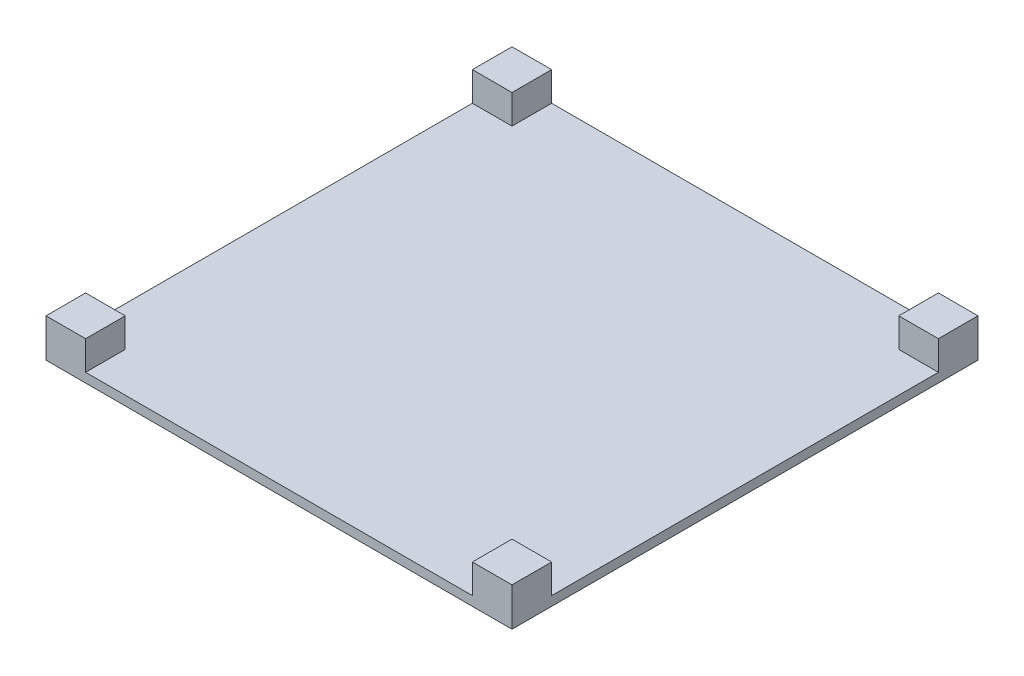
ISO-10303-21;
HEADER;
FILE_DESCRIPTION(('STEP AP214'),'2;1');
FILE_NAME('part.step','',(''),(''),'','','');
FILE_SCHEMA(('AUTOMOTIVE_DESIGN { 1 0 10303 214 1 1 1 1 }'));
ENDSEC;
DATA;
#1=APPLICATION_CONTEXT('core data for automotive mechanical design processes');
#2=APPLICATION_PROTOCOL_DEFINITION('international standard','automotive_design',2000,#1);
#3=PRODUCT_CONTEXT('',#1,'mechanical');
#4=PRODUCT('Part','Part','',(#3));
#5=PRODUCT_RELATED_PRODUCT_CATEGORY('part','',(#4));
#6=PRODUCT_DEFINITION_FORMATION('','',#4);
#7=PRODUCT_DEFINITION_CONTEXT('part definition',#1,'design');
#8=PRODUCT_DEFINITION('design','',#6,#7);
#9=PRODUCT_DEFINITION_SHAPE('','',#8);
#10=(LENGTH_UNIT() NAMED_UNIT(*) SI_UNIT(.MILLI.,.METRE.));
#11=(NAMED_UNIT(*) PLANE_ANGLE_UNIT() SI_UNIT($,.RADIAN.));
#12=(NAMED_UNIT(*) SI_UNIT($,.STERADIAN.) SOLID_ANGLE_UNIT());
#13=UNCERTAINTY_MEASURE_WITH_UNIT(LENGTH_MEASURE(1.E-05),#10,'distance_accuracy_value','');
#14=(GEOMETRIC_REPRESENTATION_CONTEXT(3) GLOBAL_UNCERTAINTY_ASSIGNED_CONTEXT((#13)) GLOBAL_UNIT_ASSIGNED_CONTEXT((#10,
#11,#12)) REPRESENTATION_CONTEXT('',''));
#15=CARTESIAN_POINT('',(0.,0.,0.));
#16=DIRECTION('',(0.,0.,1.));
#17=DIRECTION('',(1.,0.,0.));
#18=AXIS2_PLACEMENT_3D('',#15,#16,#17);
#19=CARTESIAN_POINT('',(0.,2.,0.));
#20=DIRECTION('',(0.,-1.,0.));
#21=DIRECTION('',(0.,0.,-1.));
#22=AXIS2_PLACEMENT_3D('',#19,#20,#21);
#23=PLANE('',#22);
#24=DIRECTION('',(1.,0.,0.));
#25=VECTOR('',#24,1.);
#26=CARTESIAN_POINT('',(-50.,2.,-41.5));
#27=LINE('',#26,#25);
#28=CARTESIAN_POINT('',(-50.,2.,-41.5));
#29=VERTEX_POINT('',#28);
#30=CARTESIAN_POINT('',(-41.5,2.,-41.5));
#31=VERTEX_POINT('',#30);
#32=EDGE_CURVE('E330',#29,#31,#27,.T.);
#33=ORIENTED_EDGE('',*,*,#32,.F.);
#34=DIRECTION('',(0.,0.,1.));
#35=VECTOR('',#34,1.);
#36=CARTESIAN_POINT('',(-50.,2.,50.));
#37=LINE('',#36,#35);
#38=CARTESIAN_POINT('',(-50.,2.,41.5));
#39=VERTEX_POINT('',#38);
#40=EDGE_CURVE('E167',#29,#39,#37,.T.);
#41=ORIENTED_EDGE('',*,*,#40,.T.);
#42=DIRECTION('',(-1.,0.,0.));
#43=VECTOR('',#42,1.);
#44=CARTESIAN_POINT('',(-50.,2.,41.5));
#45=LINE('',#44,#43);
#46=CARTESIAN_POINT('',(-41.5,2.,41.5));
#47=VERTEX_POINT('',#46);
#48=EDGE_CURVE('E202',#47,#39,#45,.T.);
#49=ORIENTED_EDGE('',*,*,#48,.F.);
#50=DIRECTION('',(0.,0.,-1.));
#51=VECTOR('',#50,1.);
#52=CARTESIAN_POINT('',(-41.5,2.,50.));
#53=LINE('',#52,#51);
#54=CARTESIAN_POINT('',(-41.5,2.,50.));
#55=VERTEX_POINT('',#54);
#56=EDGE_CURVE('E197',#55,#47,#53,.T.);
#57=ORIENTED_EDGE('',*,*,#56,.F.);
#58=DIRECTION('',(1.,0.,0.));
#59=VECTOR('',#58,1.);
#60=CARTESIAN_POINT('',(-50.,2.,50.));
#61=LINE('',#60,#59);
#62=CARTESIAN_POINT('',(41.5,2.,50.));
#63=VERTEX_POINT('',#62);
#64=EDGE_CURVE('E251',#55,#63,#61,.T.);
#65=ORIENTED_EDGE('',*,*,#64,.T.);
#66=DIRECTION('',(0.,0.,1.));
#67=VECTOR('',#66,1.);
#68=CARTESIAN_POINT('',(41.5,2.,50.));
#69=LINE('',#68,#67);
#70=CARTESIAN_POINT('',(41.5,2.,41.5));
#71=VERTEX_POINT('',#70);
#72=EDGE_CURVE('E225',#71,#63,#69,.T.);
#73=ORIENTED_EDGE('',*,*,#72,.F.);
#74=DIRECTION('',(-1.,0.,0.));
#75=VECTOR('',#74,1.);
#76=CARTESIAN_POINT('',(50.,2.,41.5));
#77=LINE('',#76,#75);
#78=CARTESIAN_POINT('',(50.,2.,41.5));
#79=VERTEX_POINT('',#78);
#80=EDGE_CURVE('E220',#79,#71,#77,.T.);
#81=ORIENTED_EDGE('',*,*,#80,.F.);
#82=DIRECTION('',(0.,0.,-1.));
#83=VECTOR('',#82,1.);
#84=CARTESIAN_POINT('',(50.,2.,50.));
#85=LINE('',#84,#83);
#86=CARTESIAN_POINT('',(50.,2.,-41.5));
#87=VERTEX_POINT('',#86);
#88=EDGE_CURVE('E246',#79,#87,#85,.T.);
#89=ORIENTED_EDGE('',*,*,#88,.T.);
#90=DIRECTION('',(1.,0.,0.));
#91=VECTOR('',#90,1.);
#92=CARTESIAN_POINT('',(50.,2.,-41.5));
#93=LINE('',#92,#91);
#94=CARTESIAN_POINT('',(41.5,2.,-41.5));
#95=VERTEX_POINT('',#94);
#96=EDGE_CURVE('E171',#95,#87,#93,.T.);
#97=ORIENTED_EDGE('',*,*,#96,.F.);
#98=DIRECTION('',(0.,0.,1.));
#99=VECTOR('',#98,1.);
#100=CARTESIAN_POINT('',(41.5,2.,-50.));
#101=LINE('',#100,#99);
#102=CARTESIAN_POINT('',(41.5,2.,-50.));
#103=VERTEX_POINT('',#102);
#104=EDGE_CURVE('E168',#103,#95,#101,.T.);
#105=ORIENTED_EDGE('',*,*,#104,.F.);
#106=DIRECTION('',(-1.,0.,0.));
#107=VECTOR('',#106,1.);
#108=CARTESIAN_POINT('',(-50.,2.,-50.));
#109=LINE('',#108,#107);
#110=CARTESIAN_POINT('',(-41.5,2.,-50.));
#111=VERTEX_POINT('',#110);
#112=EDGE_CURVE('E53',#103,#111,#109,.T.);
#113=ORIENTED_EDGE('',*,*,#112,.T.);
#114=DIRECTION('',(0.,0.,-1.));
#115=VECTOR('',#114,1.);
#116=CARTESIAN_POINT('',(-41.5,2.,-50.));
#117=LINE('',#116,#115);
#118=EDGE_CURVE('E48',#31,#111,#117,.T.);
#119=ORIENTED_EDGE('',*,*,#118,.F.);
#120=EDGE_LOOP('',(#33,#41,#49,#57,#65,#73,#81,#89,#97,#105,#113,#119));
#121=FACE_BOUND('',#120,.T.);
#122=ADVANCED_FACE('F33',(#121),#23,.F.);
#123=CARTESIAN_POINT('',(50.,2.,50.));
#124=DIRECTION('',(-1.,0.,0.));
#125=DIRECTION('',(0.,0.,1.));
#126=AXIS2_PLACEMENT_3D('',#123,#124,#125);
#127=PLANE('',#126);
#128=DIRECTION('',(0.,0.,-1.));
#129=VECTOR('',#128,1.);
#130=CARTESIAN_POINT('',(50.,0.,50.));
#131=LINE('',#130,#129);
#132=CARTESIAN_POINT('',(50.,0.,50.));
#133=VERTEX_POINT('',#132);
#134=CARTESIAN_POINT('',(50.,0.,-50.));
#135=VERTEX_POINT('',#134);
#136=EDGE_CURVE('E245',#133,#135,#131,.T.);
#137=ORIENTED_EDGE('',*,*,#136,.T.);
#138=DIRECTION('',(0.,-1.,0.));
#139=VECTOR('',#138,1.);
#140=CARTESIAN_POINT('',(50.,2.,-50.));
#141=LINE('',#140,#139);
#142=CARTESIAN_POINT('',(50.,8.25,-50.));
#143=VERTEX_POINT('',#142);
#144=EDGE_CURVE('E11',#143,#135,#141,.T.);
#145=ORIENTED_EDGE('',*,*,#144,.F.);
#146=DIRECTION('',(0.,0.,-1.));
#147=VECTOR('',#146,1.);
#148=CARTESIAN_POINT('',(50.,8.25,-50.));
#149=LINE('',#148,#147);
#150=CARTESIAN_POINT('',(50.,8.25,-41.5));
#151=VERTEX_POINT('',#150);
#152=EDGE_CURVE('E177',#151,#143,#149,.T.);
#153=ORIENTED_EDGE('',*,*,#152,.F.);
#154=DIRECTION('',(0.,-1.,0.));
#155=VECTOR('',#154,1.);
#156=CARTESIAN_POINT('',(50.,8.25,-41.5));
#157=LINE('',#156,#155);
#158=EDGE_CURVE('E185',#151,#87,#157,.T.);
#159=ORIENTED_EDGE('',*,*,#158,.T.);
#160=ORIENTED_EDGE('',*,*,#88,.F.);
#161=DIRECTION('',(0.,-1.,0.));
#162=VECTOR('',#161,1.);
#163=CARTESIAN_POINT('',(50.,8.25,41.5));
#164=LINE('',#163,#162);
#165=CARTESIAN_POINT('',(50.,8.25,41.5));
#166=VERTEX_POINT('',#165);
#167=EDGE_CURVE('E242',#166,#79,#164,.T.);
#168=ORIENTED_EDGE('',*,*,#167,.F.);
#169=DIRECTION('',(0.,0.,-1.));
#170=VECTOR('',#169,1.);
#171=CARTESIAN_POINT('',(50.,8.25,50.));
#172=LINE('',#171,#170);
#173=CARTESIAN_POINT('',(50.,8.25,50.));
#174=VERTEX_POINT('',#173);
#175=EDGE_CURVE('E221',#174,#166,#172,.T.);
#176=ORIENTED_EDGE('',*,*,#175,.F.);
#177=DIRECTION('',(0.,-1.,0.));
#178=VECTOR('',#177,1.);
#179=CARTESIAN_POINT('',(50.,2.,50.));
#180=LINE('',#179,#178);
#181=EDGE_CURVE('E253',#174,#133,#180,.T.);
#182=ORIENTED_EDGE('',*,*,#181,.T.);
#183=EDGE_LOOP('',(#137,#145,#153,#159,#160,#168,#176,#182));
#184=FACE_BOUND('',#183,.T.);
#185=ADVANCED_FACE('F35',(#184),#127,.F.);
#186=CARTESIAN_POINT('',(-50.,2.,-50.));
#187=DIRECTION('',(0.,0.,1.));
#188=DIRECTION('',(1.,0.,0.));
#189=AXIS2_PLACEMENT_3D('',#186,#187,#188);
#190=PLANE('',#189);
#191=DIRECTION('',(-1.,0.,0.));
#192=VECTOR('',#191,1.);
#193=CARTESIAN_POINT('',(-50.,0.,-50.));
#194=LINE('',#193,#192);
#195=CARTESIAN_POINT('',(-50.,0.,-50.));
#196=VERTEX_POINT('',#195);
#197=EDGE_CURVE('E256',#135,#196,#194,.T.);
#198=ORIENTED_EDGE('',*,*,#197,.T.);
#199=DIRECTION('',(0.,-1.,0.));
#200=VECTOR('',#199,1.);
#201=CARTESIAN_POINT('',(-50.,2.,-50.));
#202=LINE('',#201,#200);
#203=CARTESIAN_POINT('',(-50.,8.25,-50.));
#204=VERTEX_POINT('',#203);
#205=EDGE_CURVE('E41',#204,#196,#202,.T.);
#206=ORIENTED_EDGE('',*,*,#205,.F.);
#207=DIRECTION('',(-1.,0.,0.));
#208=VECTOR('',#207,1.);
#209=CARTESIAN_POINT('',(-50.,8.25,-50.));
#210=LINE('',#209,#208);
#211=CARTESIAN_POINT('',(-41.5,8.25,-50.));
#212=VERTEX_POINT('',#211);
#213=EDGE_CURVE('E161',#212,#204,#210,.T.);
#214=ORIENTED_EDGE('',*,*,#213,.F.);
#215=DIRECTION('',(0.,-1.,0.));
#216=VECTOR('',#215,1.);
#217=CARTESIAN_POINT('',(-41.5,8.25,-50.));
#218=LINE('',#217,#216);
#219=EDGE_CURVE('E173',#212,#111,#218,.T.);
#220=ORIENTED_EDGE('',*,*,#219,.T.);
#221=ORIENTED_EDGE('',*,*,#112,.F.);
#222=DIRECTION('',(0.,-1.,0.));
#223=VECTOR('',#222,1.);
#224=CARTESIAN_POINT('',(41.5,8.25,-50.));
#225=LINE('',#224,#223);
#226=CARTESIAN_POINT('',(41.5,8.25,-50.));
#227=VERTEX_POINT('',#226);
#228=EDGE_CURVE('E194',#227,#103,#225,.T.);
#229=ORIENTED_EDGE('',*,*,#228,.F.);
#230=DIRECTION('',(-1.,0.,0.));
#231=VECTOR('',#230,1.);
#232=CARTESIAN_POINT('',(50.,8.25,-50.));
#233=LINE('',#232,#231);
#234=EDGE_CURVE('E180',#143,#227,#233,.T.);
#235=ORIENTED_EDGE('',*,*,#234,.F.);
#236=ORIENTED_EDGE('',*,*,#144,.T.);
#237=EDGE_LOOP('',(#198,#206,#214,#220,#221,#229,#235,#236));
#238=FACE_BOUND('',#237,.T.);
#239=ADVANCED_FACE('F303',(#238),#190,.F.);
#240=CARTESIAN_POINT('',(-50.,2.,50.));
#241=DIRECTION('',(1.,0.,0.));
#242=DIRECTION('',(0.,0.,-1.));
#243=AXIS2_PLACEMENT_3D('',#240,#241,#242);
#244=PLANE('',#243);
#245=DIRECTION('',(0.,0.,1.));
#246=VECTOR('',#245,1.);
#247=CARTESIAN_POINT('',(-50.,0.,50.));
#248=LINE('',#247,#246);
#249=CARTESIAN_POINT('',(-50.,0.,50.));
#250=VERTEX_POINT('',#249);
#251=EDGE_CURVE('E258',#196,#250,#248,.T.);
#252=ORIENTED_EDGE('',*,*,#251,.T.);
#253=DIRECTION('',(0.,-1.,0.));
#254=VECTOR('',#253,1.);
#255=CARTESIAN_POINT('',(-50.,2.,50.));
#256=LINE('',#255,#254);
#257=CARTESIAN_POINT('',(-50.,8.25,50.));
#258=VERTEX_POINT('',#257);
#259=EDGE_CURVE('E263',#258,#250,#256,.T.);
#260=ORIENTED_EDGE('',*,*,#259,.F.);
#261=DIRECTION('',(0.,0.,1.));
#262=VECTOR('',#261,1.);
#263=CARTESIAN_POINT('',(-50.,8.25,50.));
#264=LINE('',#263,#262);
#265=CARTESIAN_POINT('',(-50.,8.25,41.5));
#266=VERTEX_POINT('',#265);
#267=EDGE_CURVE('E198',#266,#258,#264,.T.);
#268=ORIENTED_EDGE('',*,*,#267,.F.);
#269=DIRECTION('',(0.,-1.,0.));
#270=VECTOR('',#269,1.);
#271=CARTESIAN_POINT('',(-50.,8.25,41.5));
#272=LINE('',#271,#270);
#273=EDGE_CURVE('E208',#266,#39,#272,.T.);
#274=ORIENTED_EDGE('',*,*,#273,.T.);
#275=ORIENTED_EDGE('',*,*,#40,.F.);
#276=DIRECTION('',(0.,-1.,0.));
#277=VECTOR('',#276,1.);
#278=CARTESIAN_POINT('',(-50.,8.25,-41.5));
#279=LINE('',#278,#277);
#280=CARTESIAN_POINT('',(-50.,8.25,-41.5));
#281=VERTEX_POINT('',#280);
#282=EDGE_CURVE('E149',#281,#29,#279,.T.);
#283=ORIENTED_EDGE('',*,*,#282,.F.);
#284=DIRECTION('',(0.,0.,1.));
#285=VECTOR('',#284,1.);
#286=CARTESIAN_POINT('',(-50.,8.25,-50.));
#287=LINE('',#286,#285);
#288=EDGE_CURVE('E155',#204,#281,#287,.T.);
#289=ORIENTED_EDGE('',*,*,#288,.F.);
#290=ORIENTED_EDGE('',*,*,#205,.T.);
#291=EDGE_LOOP('',(#252,#260,#268,#274,#275,#283,#289,#290));
#292=FACE_BOUND('',#291,.T.);
#293=ADVANCED_FACE('F165',(#292),#244,.F.);
#294=CARTESIAN_POINT('',(-50.,2.,50.));
#295=DIRECTION('',(0.,0.,-1.));
#296=DIRECTION('',(-1.,0.,0.));
#297=AXIS2_PLACEMENT_3D('',#294,#295,#296);
#298=PLANE('',#297);
#299=DIRECTION('',(1.,0.,0.));
#300=VECTOR('',#299,1.);
#301=CARTESIAN_POINT('',(-50.,0.,50.));
#302=LINE('',#301,#300);
#303=EDGE_CURVE('E248',#250,#133,#302,.T.);
#304=ORIENTED_EDGE('',*,*,#303,.T.);
#305=ORIENTED_EDGE('',*,*,#181,.F.);
#306=DIRECTION('',(1.,0.,0.));
#307=VECTOR('',#306,1.);
#308=CARTESIAN_POINT('',(50.,8.25,50.));
#309=LINE('',#308,#307);
#310=CARTESIAN_POINT('',(41.5,8.25,50.));
#311=VERTEX_POINT('',#310);
#312=EDGE_CURVE('E229',#311,#174,#309,.T.);
#313=ORIENTED_EDGE('',*,*,#312,.F.);
#314=DIRECTION('',(0.,-1.,0.));
#315=VECTOR('',#314,1.);
#316=CARTESIAN_POINT('',(41.5,8.25,50.));
#317=LINE('',#316,#315);
#318=EDGE_CURVE('E232',#311,#63,#317,.T.);
#319=ORIENTED_EDGE('',*,*,#318,.T.);
#320=ORIENTED_EDGE('',*,*,#64,.F.);
#321=DIRECTION('',(0.,-1.,0.));
#322=VECTOR('',#321,1.);
#323=CARTESIAN_POINT('',(-41.5,8.25,50.));
#324=LINE('',#323,#322);
#325=CARTESIAN_POINT('',(-41.5,8.25,50.));
#326=VERTEX_POINT('',#325);
#327=EDGE_CURVE('E217',#326,#55,#324,.T.);
#328=ORIENTED_EDGE('',*,*,#327,.F.);
#329=DIRECTION('',(1.,0.,0.));
#330=VECTOR('',#329,1.);
#331=CARTESIAN_POINT('',(-50.,8.25,50.));
#332=LINE('',#331,#330);
#333=EDGE_CURVE('E201',#258,#326,#332,.T.);
#334=ORIENTED_EDGE('',*,*,#333,.F.);
#335=ORIENTED_EDGE('',*,*,#259,.T.);
#336=EDGE_LOOP('',(#304,#305,#313,#319,#320,#328,#334,#335));
#337=FACE_BOUND('',#336,.T.);
#338=ADVANCED_FACE('F272',(#337),#298,.F.);
#339=CARTESIAN_POINT('',(0.,0.,0.));
#340=DIRECTION('',(0.,-1.,0.));
#341=DIRECTION('',(0.,0.,-1.));
#342=AXIS2_PLACEMENT_3D('',#339,#340,#341);
#343=PLANE('',#342);
#344=ORIENTED_EDGE('',*,*,#136,.F.);
#345=ORIENTED_EDGE('',*,*,#303,.F.);
#346=ORIENTED_EDGE('',*,*,#251,.F.);
#347=ORIENTED_EDGE('',*,*,#197,.F.);
#348=EDGE_LOOP('',(#344,#345,#346,#347));
#349=FACE_BOUND('',#348,.T.);
#350=ADVANCED_FACE('F270',(#349),#343,.T.);
#351=CARTESIAN_POINT('',(50.,8.25,41.5));
#352=DIRECTION('',(0.,0.,1.));
#353=DIRECTION('',(1.,0.,0.));
#354=AXIS2_PLACEMENT_3D('',#351,#352,#353);
#355=PLANE('',#354);
#356=ORIENTED_EDGE('',*,*,#80,.T.);
#357=DIRECTION('',(0.,-1.,0.));
#358=VECTOR('',#357,1.);
#359=CARTESIAN_POINT('',(41.5,8.25,41.5));
#360=LINE('',#359,#358);
#361=CARTESIAN_POINT('',(41.5,8.25,41.5));
#362=VERTEX_POINT('',#361);
#363=EDGE_CURVE('E239',#362,#71,#360,.T.);
#364=ORIENTED_EDGE('',*,*,#363,.F.);
#365=DIRECTION('',(-1.,0.,0.));
#366=VECTOR('',#365,1.);
#367=CARTESIAN_POINT('',(50.,8.25,41.5));
#368=LINE('',#367,#366);
#369=EDGE_CURVE('E224',#166,#362,#368,.T.);
#370=ORIENTED_EDGE('',*,*,#369,.F.);
#371=ORIENTED_EDGE('',*,*,#167,.T.);
#372=EDGE_LOOP('',(#356,#364,#370,#371));
#373=FACE_BOUND('',#372,.T.);
#374=ADVANCED_FACE('F289',(#373),#355,.F.);
#375=CARTESIAN_POINT('',(41.5,8.25,50.));
#376=DIRECTION('',(1.,0.,0.));
#377=DIRECTION('',(0.,0.,-1.));
#378=AXIS2_PLACEMENT_3D('',#375,#376,#377);
#379=PLANE('',#378);
#380=ORIENTED_EDGE('',*,*,#72,.T.);
#381=ORIENTED_EDGE('',*,*,#318,.F.);
#382=DIRECTION('',(0.,0.,1.));
#383=VECTOR('',#382,1.);
#384=CARTESIAN_POINT('',(41.5,8.25,50.));
#385=LINE('',#384,#383);
#386=EDGE_CURVE('E227',#362,#311,#385,.T.);
#387=ORIENTED_EDGE('',*,*,#386,.F.);
#388=ORIENTED_EDGE('',*,*,#363,.T.);
#389=EDGE_LOOP('',(#380,#381,#387,#388));
#390=FACE_BOUND('',#389,.T.);
#391=ADVANCED_FACE('F287',(#390),#379,.F.);
#392=CARTESIAN_POINT('',(0.,8.25,0.));
#393=DIRECTION('',(0.,1.,0.));
#394=DIRECTION('',(0.,0.,1.));
#395=AXIS2_PLACEMENT_3D('',#392,#393,#394);
#396=PLANE('',#395);
#397=ORIENTED_EDGE('',*,*,#175,.T.);
#398=ORIENTED_EDGE('',*,*,#369,.T.);
#399=ORIENTED_EDGE('',*,*,#386,.T.);
#400=ORIENTED_EDGE('',*,*,#312,.T.);
#401=EDGE_LOOP('',(#397,#398,#399,#400));
#402=FACE_BOUND('',#401,.T.);
#403=ADVANCED_FACE('F280',(#402),#396,.T.);
#404=CARTESIAN_POINT('',(-41.5,8.25,50.));
#405=DIRECTION('',(-1.,0.,0.));
#406=DIRECTION('',(0.,0.,1.));
#407=AXIS2_PLACEMENT_3D('',#404,#405,#406);
#408=PLANE('',#407);
#409=ORIENTED_EDGE('',*,*,#56,.T.);
#410=DIRECTION('',(0.,-1.,0.));
#411=VECTOR('',#410,1.);
#412=CARTESIAN_POINT('',(-41.5,8.25,41.5));
#413=LINE('',#412,#411);
#414=CARTESIAN_POINT('',(-41.5,8.25,41.5));
#415=VERTEX_POINT('',#414);
#416=EDGE_CURVE('E214',#415,#47,#413,.T.);
#417=ORIENTED_EDGE('',*,*,#416,.F.);
#418=DIRECTION('',(0.,0.,-1.));
#419=VECTOR('',#418,1.);
#420=CARTESIAN_POINT('',(-41.5,8.25,50.));
#421=LINE('',#420,#419);
#422=EDGE_CURVE('E204',#326,#415,#421,.T.);
#423=ORIENTED_EDGE('',*,*,#422,.F.);
#424=ORIENTED_EDGE('',*,*,#327,.T.);
#425=EDGE_LOOP('',(#409,#417,#423,#424));
#426=FACE_BOUND('',#425,.T.);
#427=ADVANCED_FACE('F355',(#426),#408,.F.);
#428=CARTESIAN_POINT('',(-50.,8.25,41.5));
#429=DIRECTION('',(0.,0.,1.));
#430=DIRECTION('',(1.,0.,0.));
#431=AXIS2_PLACEMENT_3D('',#428,#429,#430);
#432=PLANE('',#431);
#433=ORIENTED_EDGE('',*,*,#48,.T.);
#434=ORIENTED_EDGE('',*,*,#273,.F.);
#435=DIRECTION('',(-1.,0.,0.));
#436=VECTOR('',#435,1.);
#437=CARTESIAN_POINT('',(-50.,8.25,41.5));
#438=LINE('',#437,#436);
#439=EDGE_CURVE('E206',#415,#266,#438,.T.);
#440=ORIENTED_EDGE('',*,*,#439,.F.);
#441=ORIENTED_EDGE('',*,*,#416,.T.);
#442=EDGE_LOOP('',(#433,#434,#440,#441));
#443=FACE_BOUND('',#442,.T.);
#444=ADVANCED_FACE('F351',(#443),#432,.F.);
#445=CARTESIAN_POINT('',(0.,8.25,0.));
#446=DIRECTION('',(0.,-1.,0.));
#447=DIRECTION('',(0.,0.,-1.));
#448=AXIS2_PLACEMENT_3D('',#445,#446,#447);
#449=PLANE('',#448);
#450=ORIENTED_EDGE('',*,*,#267,.T.);
#451=ORIENTED_EDGE('',*,*,#333,.T.);
#452=ORIENTED_EDGE('',*,*,#422,.T.);
#453=ORIENTED_EDGE('',*,*,#439,.T.);
#454=EDGE_LOOP('',(#450,#451,#452,#453));
#455=FACE_BOUND('',#454,.T.);
#456=ADVANCED_FACE('F348',(#455),#449,.F.);
#457=CARTESIAN_POINT('',(41.5,8.25,-50.));
#458=DIRECTION('',(1.,0.,0.));
#459=DIRECTION('',(0.,0.,-1.));
#460=AXIS2_PLACEMENT_3D('',#457,#458,#459);
#461=PLANE('',#460);
#462=ORIENTED_EDGE('',*,*,#104,.T.);
#463=DIRECTION('',(0.,-1.,0.));
#464=VECTOR('',#463,1.);
#465=CARTESIAN_POINT('',(41.5,8.25,-41.5));
#466=LINE('',#465,#464);
#467=CARTESIAN_POINT('',(41.5,8.25,-41.5));
#468=VERTEX_POINT('',#467);
#469=EDGE_CURVE('E191',#468,#95,#466,.T.);
#470=ORIENTED_EDGE('',*,*,#469,.F.);
#471=DIRECTION('',(0.,0.,1.));
#472=VECTOR('',#471,1.);
#473=CARTESIAN_POINT('',(41.5,8.25,-50.));
#474=LINE('',#473,#472);
#475=EDGE_CURVE('E182',#227,#468,#474,.T.);
#476=ORIENTED_EDGE('',*,*,#475,.F.);
#477=ORIENTED_EDGE('',*,*,#228,.T.);
#478=EDGE_LOOP('',(#462,#470,#476,#477));
#479=FACE_BOUND('',#478,.T.);
#480=ADVANCED_FACE('F323',(#479),#461,.F.);
#481=CARTESIAN_POINT('',(50.,8.25,-41.5));
#482=DIRECTION('',(0.,0.,-1.));
#483=DIRECTION('',(-1.,0.,0.));
#484=AXIS2_PLACEMENT_3D('',#481,#482,#483);
#485=PLANE('',#484);
#486=ORIENTED_EDGE('',*,*,#96,.T.);
#487=ORIENTED_EDGE('',*,*,#158,.F.);
#488=DIRECTION('',(1.,0.,0.));
#489=VECTOR('',#488,1.);
#490=CARTESIAN_POINT('',(50.,8.25,-41.5));
#491=LINE('',#490,#489);
#492=EDGE_CURVE('E184',#468,#151,#491,.T.);
#493=ORIENTED_EDGE('',*,*,#492,.F.);
#494=ORIENTED_EDGE('',*,*,#469,.T.);
#495=EDGE_LOOP('',(#486,#487,#493,#494));
#496=FACE_BOUND('',#495,.T.);
#497=ADVANCED_FACE('F321',(#496),#485,.F.);
#498=CARTESIAN_POINT('',(0.,8.25,0.));
#499=DIRECTION('',(0.,-1.,0.));
#500=DIRECTION('',(0.,0.,-1.));
#501=AXIS2_PLACEMENT_3D('',#498,#499,#500);
#502=PLANE('',#501);
#503=ORIENTED_EDGE('',*,*,#152,.T.);
#504=ORIENTED_EDGE('',*,*,#234,.T.);
#505=ORIENTED_EDGE('',*,*,#475,.T.);
#506=ORIENTED_EDGE('',*,*,#492,.T.);
#507=EDGE_LOOP('',(#503,#504,#505,#506));
#508=FACE_BOUND('',#507,.T.);
#509=ADVANCED_FACE('F316',(#508),#502,.F.);
#510=CARTESIAN_POINT('',(-50.,8.25,-41.5));
#511=DIRECTION('',(0.,0.,-1.));
#512=DIRECTION('',(-1.,0.,0.));
#513=AXIS2_PLACEMENT_3D('',#510,#511,#512);
#514=PLANE('',#513);
#515=ORIENTED_EDGE('',*,*,#32,.T.);
#516=DIRECTION('',(0.,-1.,0.));
#517=VECTOR('',#516,1.);
#518=CARTESIAN_POINT('',(-41.5,8.25,-41.5));
#519=LINE('',#518,#517);
#520=CARTESIAN_POINT('',(-41.5,8.25,-41.5));
#521=VERTEX_POINT('',#520);
#522=EDGE_CURVE('E151',#521,#31,#519,.T.);
#523=ORIENTED_EDGE('',*,*,#522,.F.);
#524=DIRECTION('',(1.,0.,0.));
#525=VECTOR('',#524,1.);
#526=CARTESIAN_POINT('',(-50.,8.25,-41.5));
#527=LINE('',#526,#525);
#528=EDGE_CURVE('E145',#281,#521,#527,.T.);
#529=ORIENTED_EDGE('',*,*,#528,.F.);
#530=ORIENTED_EDGE('',*,*,#282,.T.);
#531=EDGE_LOOP('',(#515,#523,#529,#530));
#532=FACE_BOUND('',#531,.T.);
#533=ADVANCED_FACE('F147',(#532),#514,.F.);
#534=CARTESIAN_POINT('',(-41.5,8.25,-50.));
#535=DIRECTION('',(-1.,0.,0.));
#536=DIRECTION('',(0.,0.,1.));
#537=AXIS2_PLACEMENT_3D('',#534,#535,#536);
#538=PLANE('',#537);
#539=ORIENTED_EDGE('',*,*,#118,.T.);
#540=ORIENTED_EDGE('',*,*,#219,.F.);
#541=DIRECTION('',(0.,0.,-1.));
#542=VECTOR('',#541,1.);
#543=CARTESIAN_POINT('',(-41.5,8.25,-50.));
#544=LINE('',#543,#542);
#545=EDGE_CURVE('E154',#521,#212,#544,.T.);
#546=ORIENTED_EDGE('',*,*,#545,.F.);
#547=ORIENTED_EDGE('',*,*,#522,.T.);
#548=EDGE_LOOP('',(#539,#540,#546,#547));
#549=FACE_BOUND('',#548,.T.);
#550=ADVANCED_FACE('F332',(#549),#538,.F.);
#551=CARTESIAN_POINT('',(0.,8.25,0.));
#552=DIRECTION('',(0.,1.,0.));
#553=DIRECTION('',(0.,0.,1.));
#554=AXIS2_PLACEMENT_3D('',#551,#552,#553);
#555=PLANE('',#554);
#556=ORIENTED_EDGE('',*,*,#288,.T.);
#557=ORIENTED_EDGE('',*,*,#528,.T.);
#558=ORIENTED_EDGE('',*,*,#545,.T.);
#559=ORIENTED_EDGE('',*,*,#213,.T.);
#560=EDGE_LOOP('',(#556,#557,#558,#559));
#561=FACE_BOUND('',#560,.T.);
#562=ADVANCED_FACE('F159',(#561),#555,.T.);
#563=CLOSED_SHELL('',(#122,#185,#239,#293,#338,#350,#374,#391,#403,#427,#444,#456,#480,#497,
#509,#533,#550,#562));
#564=MANIFOLD_SOLID_BREP('B2',#563);
#565=ADVANCED_BREP_SHAPE_REPRESENTATION('',(#18,#564),#14);
#566=SHAPE_DEFINITION_REPRESENTATION(#9,#565);
ENDSEC;
END-ISO-10303-21;
